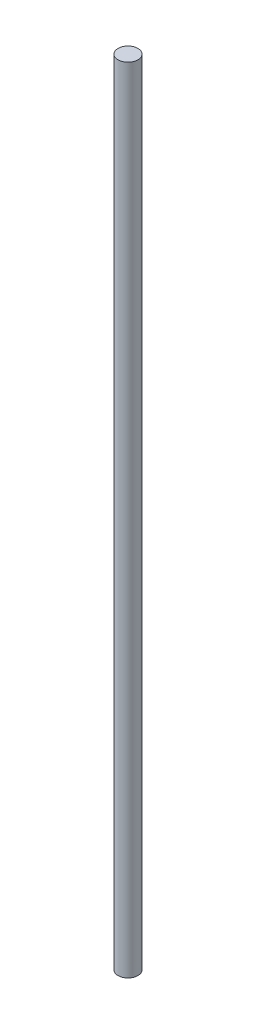
ISO-10303-21;
HEADER;
FILE_DESCRIPTION(('STEP AP214'),'2;1');
FILE_NAME('part.step','',(''),(''),'','','');
FILE_SCHEMA(('AUTOMOTIVE_DESIGN { 1 0 10303 214 1 1 1 1 }'));
ENDSEC;
DATA;
#1=APPLICATION_CONTEXT('core data for automotive mechanical design processes');
#2=APPLICATION_PROTOCOL_DEFINITION('international standard','automotive_design',2000,#1);
#3=PRODUCT_CONTEXT('',#1,'mechanical');
#4=PRODUCT('Part','Part','',(#3));
#5=PRODUCT_RELATED_PRODUCT_CATEGORY('part','',(#4));
#6=PRODUCT_DEFINITION_FORMATION('','',#4);
#7=PRODUCT_DEFINITION_CONTEXT('part definition',#1,'design');
#8=PRODUCT_DEFINITION('design','',#6,#7);
#9=PRODUCT_DEFINITION_SHAPE('','',#8);
#10=(LENGTH_UNIT() NAMED_UNIT(*) SI_UNIT(.MILLI.,.METRE.));
#11=(NAMED_UNIT(*) PLANE_ANGLE_UNIT() SI_UNIT($,.RADIAN.));
#12=(NAMED_UNIT(*) SI_UNIT($,.STERADIAN.) SOLID_ANGLE_UNIT());
#13=UNCERTAINTY_MEASURE_WITH_UNIT(LENGTH_MEASURE(1.E-05),#10,'distance_accuracy_value','');
#14=(GEOMETRIC_REPRESENTATION_CONTEXT(3) GLOBAL_UNCERTAINTY_ASSIGNED_CONTEXT((#13)) GLOBAL_UNIT_ASSIGNED_CONTEXT((#10,
#11,#12)) REPRESENTATION_CONTEXT('',''));
#15=CARTESIAN_POINT('',(0.,0.,0.));
#16=DIRECTION('',(0.,0.,1.));
#17=DIRECTION('',(1.,0.,0.));
#18=AXIS2_PLACEMENT_3D('',#15,#16,#17);
#19=CARTESIAN_POINT('',(0.,380.,0.));
#20=DIRECTION('',(0.,-1.,0.));
#21=DIRECTION('',(0.,0.,-1.));
#22=AXIS2_PLACEMENT_3D('',#19,#20,#21);
#23=CYLINDRICAL_SURFACE('',#22,4.7625);
#24=CARTESIAN_POINT('',(0.,380.,0.));
#25=DIRECTION('',(0.,1.,0.));
#26=DIRECTION('',(0.,0.,1.));
#27=AXIS2_PLACEMENT_3D('',#24,#25,#26);
#28=CIRCLE('',#27,4.7625);
#29=CARTESIAN_POINT('',(0.,380.,4.7625));
#30=VERTEX_POINT('',#29);
#31=EDGE_CURVE('E10',#30,#30,#28,.T.);
#32=ORIENTED_EDGE('',*,*,#31,.F.);
#33=EDGE_LOOP('',(#32));
#34=FACE_BOUND('',#33,.T.);
#35=CARTESIAN_POINT('',(0.,0.,0.));
#36=DIRECTION('',(0.,1.,0.));
#37=DIRECTION('',(0.,0.,1.));
#38=AXIS2_PLACEMENT_3D('',#35,#36,#37);
#39=CIRCLE('',#38,4.7625);
#40=CARTESIAN_POINT('',(0.,0.,4.7625));
#41=VERTEX_POINT('',#40);
#42=EDGE_CURVE('E33',#41,#41,#39,.T.);
#43=ORIENTED_EDGE('',*,*,#42,.T.);
#44=EDGE_LOOP('',(#43));
#45=FACE_BOUND('',#44,.T.);
#46=ADVANCED_FACE('F30',(#34,#45),#23,.T.);
#47=CARTESIAN_POINT('',(0.,380.,0.));
#48=DIRECTION('',(0.,1.,0.));
#49=DIRECTION('',(0.,0.,1.));
#50=AXIS2_PLACEMENT_3D('',#47,#48,#49);
#51=PLANE('',#50);
#52=ORIENTED_EDGE('',*,*,#31,.T.);
#53=EDGE_LOOP('',(#52));
#54=FACE_BOUND('',#53,.T.);
#55=ADVANCED_FACE('F45',(#54),#51,.T.);
#56=CARTESIAN_POINT('',(0.,0.,0.));
#57=DIRECTION('',(0.,1.,0.));
#58=DIRECTION('',(0.,0.,1.));
#59=AXIS2_PLACEMENT_3D('',#56,#57,#58);
#60=PLANE('',#59);
#61=ORIENTED_EDGE('',*,*,#42,.F.);
#62=EDGE_LOOP('',(#61));
#63=FACE_BOUND('',#62,.T.);
#64=ADVANCED_FACE('F43',(#63),#60,.F.);
#65=CLOSED_SHELL('',(#46,#55,#64));
#66=MANIFOLD_SOLID_BREP('B2',#65);
#67=ADVANCED_BREP_SHAPE_REPRESENTATION('',(#18,#66),#14);
#68=SHAPE_DEFINITION_REPRESENTATION(#9,#67);
ENDSEC;
END-ISO-10303-21;
